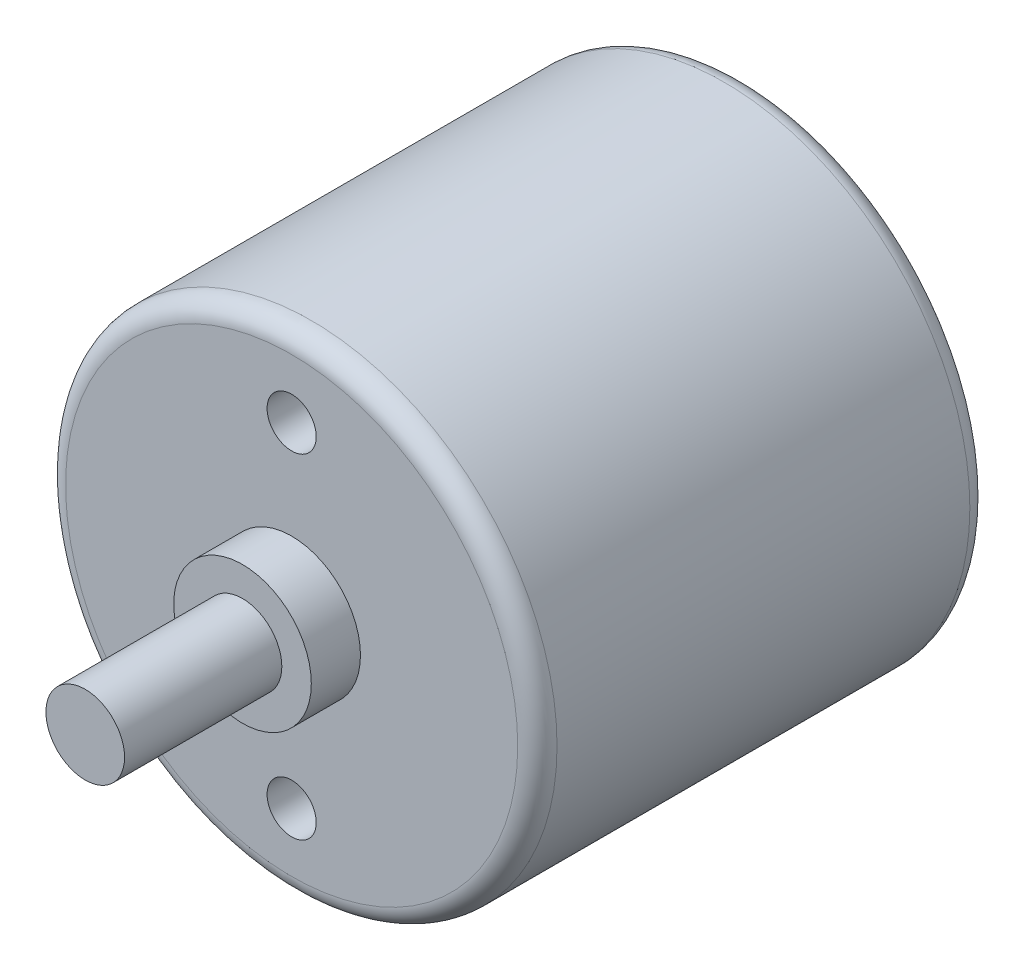
ISO-10303-21;
HEADER;
FILE_DESCRIPTION(('STEP AP214'),'2;1');
FILE_NAME('part.step','',(''),(''),'','','');
FILE_SCHEMA(('AUTOMOTIVE_DESIGN { 1 0 10303 214 1 1 1 1 }'));
ENDSEC;
DATA;
#1=APPLICATION_CONTEXT('core data for automotive mechanical design processes');
#2=APPLICATION_PROTOCOL_DEFINITION('international standard','automotive_design',2000,#1);
#3=PRODUCT_CONTEXT('',#1,'mechanical');
#4=PRODUCT('Part','Part','',(#3));
#5=PRODUCT_RELATED_PRODUCT_CATEGORY('part','',(#4));
#6=PRODUCT_DEFINITION_FORMATION('','',#4);
#7=PRODUCT_DEFINITION_CONTEXT('part definition',#1,'design');
#8=PRODUCT_DEFINITION('design','',#6,#7);
#9=PRODUCT_DEFINITION_SHAPE('','',#8);
#10=(LENGTH_UNIT() NAMED_UNIT(*) SI_UNIT(.MILLI.,.METRE.));
#11=(NAMED_UNIT(*) PLANE_ANGLE_UNIT() SI_UNIT($,.RADIAN.));
#12=(NAMED_UNIT(*) SI_UNIT($,.STERADIAN.) SOLID_ANGLE_UNIT());
#13=UNCERTAINTY_MEASURE_WITH_UNIT(LENGTH_MEASURE(1.E-05),#10,'distance_accuracy_value','');
#14=(GEOMETRIC_REPRESENTATION_CONTEXT(3) GLOBAL_UNCERTAINTY_ASSIGNED_CONTEXT((#13)) GLOBAL_UNIT_ASSIGNED_CONTEXT((#10,
#11,#12)) REPRESENTATION_CONTEXT('',''));
#15=CARTESIAN_POINT('',(0.,0.,0.));
#16=DIRECTION('',(0.,0.,1.));
#17=DIRECTION('',(1.,0.,0.));
#18=AXIS2_PLACEMENT_3D('',#15,#16,#17);
#19=CARTESIAN_POINT('',(0.,0.,25.5));
#20=DIRECTION('',(0.,0.,1.));
#21=DIRECTION('',(1.,0.,0.));
#22=AXIS2_PLACEMENT_3D('',#19,#20,#21);
#23=PLANE('',#22);
#24=CARTESIAN_POINT('',(0.,0.,25.5));
#25=DIRECTION('',(0.,0.,1.));
#26=DIRECTION('',(1.,0.,0.));
#27=AXIS2_PLACEMENT_3D('',#24,#25,#26);
#28=CIRCLE('',#27,3.5);
#29=CARTESIAN_POINT('',(3.5,0.,25.5));
#30=VERTEX_POINT('',#29);
#31=EDGE_CURVE('E51',#30,#30,#28,.T.);
#32=ORIENTED_EDGE('',*,*,#31,.T.);
#33=EDGE_LOOP('',(#32));
#34=FACE_BOUND('',#33,.T.);
#35=CARTESIAN_POINT('',(0.,0.,25.5));
#36=DIRECTION('',(0.,0.,1.));
#37=DIRECTION('',(1.,0.,0.));
#38=AXIS2_PLACEMENT_3D('',#35,#36,#37);
#39=CIRCLE('',#38,2.);
#40=CARTESIAN_POINT('',(2.,0.,25.5));
#41=VERTEX_POINT('',#40);
#42=EDGE_CURVE('E58',#41,#41,#39,.T.);
#43=ORIENTED_EDGE('',*,*,#42,.F.);
#44=EDGE_LOOP('',(#43));
#45=FACE_BOUND('',#44,.T.);
#46=ADVANCED_FACE('F31',(#34,#45),#23,.T.);
#47=CARTESIAN_POINT('',(0.,0.,23.));
#48=DIRECTION('',(0.,0.,1.));
#49=DIRECTION('',(1.,0.,0.));
#50=AXIS2_PLACEMENT_3D('',#47,#48,#49);
#51=PLANE('',#50);
#52=CARTESIAN_POINT('',(-3.65088646996817E-13,-8.5,23.));
#53=DIRECTION('',(0.,0.,1.));
#54=DIRECTION('',(1.,0.,0.));
#55=AXIS2_PLACEMENT_3D('',#52,#53,#54);
#56=CIRCLE('',#55,1.25);
#57=CARTESIAN_POINT('',(1.24999999999964,-8.5,23.));
#58=VERTEX_POINT('',#57);
#59=EDGE_CURVE('E70',#58,#58,#56,.T.);
#60=ORIENTED_EDGE('',*,*,#59,.F.);
#61=EDGE_LOOP('',(#60));
#62=FACE_BOUND('',#61,.T.);
#63=CARTESIAN_POINT('',(-3.05599595380992E-13,8.5,23.));
#64=DIRECTION('',(0.,0.,1.));
#65=DIRECTION('',(1.,0.,0.));
#66=AXIS2_PLACEMENT_3D('',#63,#64,#65);
#67=CIRCLE('',#66,1.25);
#68=CARTESIAN_POINT('',(1.2499999999997,8.5,23.));
#69=VERTEX_POINT('',#68);
#70=EDGE_CURVE('E64',#69,#69,#67,.T.);
#71=ORIENTED_EDGE('',*,*,#70,.F.);
#72=EDGE_LOOP('',(#71));
#73=FACE_BOUND('',#72,.T.);
#74=CARTESIAN_POINT('',(0.,0.,23.));
#75=DIRECTION('',(0.,0.,1.));
#76=DIRECTION('',(1.,0.,0.));
#77=AXIS2_PLACEMENT_3D('',#74,#75,#76);
#78=CIRCLE('',#77,11.5);
#79=CARTESIAN_POINT('',(11.5,0.,23.));
#80=VERTEX_POINT('',#79);
#81=EDGE_CURVE('E10',#80,#80,#78,.T.);
#82=ORIENTED_EDGE('',*,*,#81,.T.);
#83=EDGE_LOOP('',(#82));
#84=FACE_BOUND('',#83,.T.);
#85=CARTESIAN_POINT('',(0.,0.,23.));
#86=DIRECTION('',(0.,0.,1.));
#87=DIRECTION('',(1.,0.,0.));
#88=AXIS2_PLACEMENT_3D('',#85,#86,#87);
#89=CIRCLE('',#88,3.5);
#90=CARTESIAN_POINT('',(3.5,0.,23.));
#91=VERTEX_POINT('',#90);
#92=EDGE_CURVE('E52',#91,#91,#89,.T.);
#93=ORIENTED_EDGE('',*,*,#92,.F.);
#94=EDGE_LOOP('',(#93));
#95=FACE_BOUND('',#94,.T.);
#96=ADVANCED_FACE('F85',(#62,#73,#84,#95),#51,.T.);
#97=CARTESIAN_POINT('',(0.,0.,23.));
#98=DIRECTION('',(0.,0.,-1.));
#99=DIRECTION('',(-1.,0.,0.));
#100=AXIS2_PLACEMENT_3D('',#97,#98,#99);
#101=CYLINDRICAL_SURFACE('',#100,12.5);
#102=CARTESIAN_POINT('',(0.,0.,1.));
#103=DIRECTION('',(0.,0.,1.));
#104=DIRECTION('',(1.,0.,0.));
#105=AXIS2_PLACEMENT_3D('',#102,#103,#104);
#106=CIRCLE('',#105,12.5);
#107=CARTESIAN_POINT('',(12.5,0.,1.));
#108=VERTEX_POINT('',#107);
#109=EDGE_CURVE('E42',#108,#108,#106,.T.);
#110=ORIENTED_EDGE('',*,*,#109,.T.);
#111=EDGE_LOOP('',(#110));
#112=FACE_BOUND('',#111,.T.);
#113=CARTESIAN_POINT('',(0.,0.,22.));
#114=DIRECTION('',(0.,0.,1.));
#115=DIRECTION('',(1.,0.,0.));
#116=AXIS2_PLACEMENT_3D('',#113,#114,#115);
#117=CIRCLE('',#116,12.5);
#118=CARTESIAN_POINT('',(12.5,0.,22.));
#119=VERTEX_POINT('',#118);
#120=EDGE_CURVE('E46',#119,#119,#117,.F.);
#121=ORIENTED_EDGE('',*,*,#120,.T.);
#122=EDGE_LOOP('',(#121));
#123=FACE_BOUND('',#122,.T.);
#124=ADVANCED_FACE('F88',(#112,#123),#101,.T.);
#125=CARTESIAN_POINT('',(0.,0.,0.));
#126=DIRECTION('',(0.,0.,1.));
#127=DIRECTION('',(1.,0.,0.));
#128=AXIS2_PLACEMENT_3D('',#125,#126,#127);
#129=PLANE('',#128);
#130=CARTESIAN_POINT('',(0.,0.,0.));
#131=DIRECTION('',(0.,0.,1.));
#132=DIRECTION('',(1.,0.,0.));
#133=AXIS2_PLACEMENT_3D('',#130,#131,#132);
#134=CIRCLE('',#133,11.5);
#135=CARTESIAN_POINT('',(11.5,0.,0.));
#136=VERTEX_POINT('',#135);
#137=EDGE_CURVE('E38',#136,#136,#134,.F.);
#138=ORIENTED_EDGE('',*,*,#137,.T.);
#139=EDGE_LOOP('',(#138));
#140=FACE_BOUND('',#139,.T.);
#141=ADVANCED_FACE('F97',(#140),#129,.F.);
#142=CARTESIAN_POINT('',(0.,0.,25.5));
#143=DIRECTION('',(0.,0.,-1.));
#144=DIRECTION('',(-1.,0.,0.));
#145=AXIS2_PLACEMENT_3D('',#142,#143,#144);
#146=CYLINDRICAL_SURFACE('',#145,3.5);
#147=ORIENTED_EDGE('',*,*,#31,.F.);
#148=EDGE_LOOP('',(#147));
#149=FACE_BOUND('',#148,.T.);
#150=ORIENTED_EDGE('',*,*,#92,.T.);
#151=EDGE_LOOP('',(#150));
#152=FACE_BOUND('',#151,.T.);
#153=ADVANCED_FACE('F94',(#149,#152),#146,.T.);
#154=CARTESIAN_POINT('',(0.,0.,1.));
#155=DIRECTION('',(0.,0.,1.));
#156=DIRECTION('',(1.,0.,0.));
#157=AXIS2_PLACEMENT_3D('',#154,#155,#156);
#158=TOROIDAL_SURFACE('',#157,11.5,1.);
#159=ORIENTED_EDGE('',*,*,#137,.F.);
#160=EDGE_LOOP('',(#159));
#161=FACE_BOUND('',#160,.T.);
#162=ORIENTED_EDGE('',*,*,#109,.F.);
#163=EDGE_LOOP('',(#162));
#164=FACE_BOUND('',#163,.T.);
#165=ADVANCED_FACE('F96',(#161,#164),#158,.T.);
#166=CARTESIAN_POINT('',(0.,0.,22.));
#167=DIRECTION('',(0.,0.,1.));
#168=DIRECTION('',(1.,0.,0.));
#169=AXIS2_PLACEMENT_3D('',#166,#167,#168);
#170=TOROIDAL_SURFACE('',#169,11.5,1.);
#171=ORIENTED_EDGE('',*,*,#120,.F.);
#172=EDGE_LOOP('',(#171));
#173=FACE_BOUND('',#172,.T.);
#174=ORIENTED_EDGE('',*,*,#81,.F.);
#175=EDGE_LOOP('',(#174));
#176=FACE_BOUND('',#175,.T.);
#177=ADVANCED_FACE('F33',(#173,#176),#170,.T.);
#178=CARTESIAN_POINT('',(0.,0.,33.5));
#179=DIRECTION('',(0.,0.,-1.));
#180=DIRECTION('',(-1.,0.,0.));
#181=AXIS2_PLACEMENT_3D('',#178,#179,#180);
#182=CYLINDRICAL_SURFACE('',#181,2.);
#183=CARTESIAN_POINT('',(0.,0.,33.5));
#184=DIRECTION('',(0.,0.,1.));
#185=DIRECTION('',(1.,0.,0.));
#186=AXIS2_PLACEMENT_3D('',#183,#184,#185);
#187=CIRCLE('',#186,2.);
#188=CARTESIAN_POINT('',(2.,0.,33.5));
#189=VERTEX_POINT('',#188);
#190=EDGE_CURVE('E55',#189,#189,#187,.T.);
#191=ORIENTED_EDGE('',*,*,#190,.F.);
#192=EDGE_LOOP('',(#191));
#193=FACE_BOUND('',#192,.T.);
#194=ORIENTED_EDGE('',*,*,#42,.T.);
#195=EDGE_LOOP('',(#194));
#196=FACE_BOUND('',#195,.T.);
#197=ADVANCED_FACE('F114',(#193,#196),#182,.T.);
#198=CARTESIAN_POINT('',(0.,0.,33.5));
#199=DIRECTION('',(0.,0.,1.));
#200=DIRECTION('',(1.,0.,0.));
#201=AXIS2_PLACEMENT_3D('',#198,#199,#200);
#202=PLANE('',#201);
#203=ORIENTED_EDGE('',*,*,#190,.T.);
#204=EDGE_LOOP('',(#203));
#205=FACE_BOUND('',#204,.T.);
#206=ADVANCED_FACE('F117',(#205),#202,.T.);
#207=CARTESIAN_POINT('',(-3.05599595380992E-13,8.5,13.));
#208=DIRECTION('',(0.,0.,1.));
#209=DIRECTION('',(1.,0.,0.));
#210=AXIS2_PLACEMENT_3D('',#207,#208,#209);
#211=CYLINDRICAL_SURFACE('',#210,1.25);
#212=CARTESIAN_POINT('',(-3.05599595380992E-13,8.5,13.));
#213=DIRECTION('',(0.,0.,1.));
#214=DIRECTION('',(1.,0.,0.));
#215=AXIS2_PLACEMENT_3D('',#212,#213,#214);
#216=CIRCLE('',#215,1.25);
#217=CARTESIAN_POINT('',(1.2499999999997,8.5,13.));
#218=VERTEX_POINT('',#217);
#219=EDGE_CURVE('E61',#218,#218,#216,.T.);
#220=ORIENTED_EDGE('',*,*,#219,.F.);
#221=EDGE_LOOP('',(#220));
#222=FACE_BOUND('',#221,.T.);
#223=ORIENTED_EDGE('',*,*,#70,.T.);
#224=EDGE_LOOP('',(#223));
#225=FACE_BOUND('',#224,.T.);
#226=ADVANCED_FACE('F121',(#222,#225),#211,.F.);
#227=CARTESIAN_POINT('',(-3.05599595380992E-13,8.5,13.));
#228=DIRECTION('',(0.,0.,1.));
#229=DIRECTION('',(1.,0.,0.));
#230=AXIS2_PLACEMENT_3D('',#227,#228,#229);
#231=PLANE('',#230);
#232=ORIENTED_EDGE('',*,*,#219,.T.);
#233=EDGE_LOOP('',(#232));
#234=FACE_BOUND('',#233,.T.);
#235=ADVANCED_FACE('F81',(#234),#231,.T.);
#236=CARTESIAN_POINT('',(-3.65088646996817E-13,-8.5,13.));
#237=DIRECTION('',(0.,0.,1.));
#238=DIRECTION('',(1.,0.,0.));
#239=AXIS2_PLACEMENT_3D('',#236,#237,#238);
#240=CYLINDRICAL_SURFACE('',#239,1.25);
#241=CARTESIAN_POINT('',(-3.65088646996817E-13,-8.5,13.));
#242=DIRECTION('',(0.,0.,1.));
#243=DIRECTION('',(1.,0.,0.));
#244=AXIS2_PLACEMENT_3D('',#241,#242,#243);
#245=CIRCLE('',#244,1.25);
#246=CARTESIAN_POINT('',(1.24999999999964,-8.5,13.));
#247=VERTEX_POINT('',#246);
#248=EDGE_CURVE('E67',#247,#247,#245,.T.);
#249=ORIENTED_EDGE('',*,*,#248,.F.);
#250=EDGE_LOOP('',(#249));
#251=FACE_BOUND('',#250,.T.);
#252=ORIENTED_EDGE('',*,*,#59,.T.);
#253=EDGE_LOOP('',(#252));
#254=FACE_BOUND('',#253,.T.);
#255=ADVANCED_FACE('F78',(#251,#254),#240,.F.);
#256=CARTESIAN_POINT('',(-3.65088646996817E-13,-8.5,13.));
#257=DIRECTION('',(0.,0.,1.));
#258=DIRECTION('',(1.,0.,0.));
#259=AXIS2_PLACEMENT_3D('',#256,#257,#258);
#260=PLANE('',#259);
#261=ORIENTED_EDGE('',*,*,#248,.T.);
#262=EDGE_LOOP('',(#261));
#263=FACE_BOUND('',#262,.T.);
#264=ADVANCED_FACE('F76',(#263),#260,.T.);
#265=CLOSED_SHELL('',(#46,#96,#124,#141,#153,#165,#177,#197,#206,#226,#235,#255,#264));
#266=MANIFOLD_SOLID_BREP('B2',#265);
#267=ADVANCED_BREP_SHAPE_REPRESENTATION('',(#18,#266),#14);
#268=SHAPE_DEFINITION_REPRESENTATION(#9,#267);
ENDSEC;
END-ISO-10303-21;
